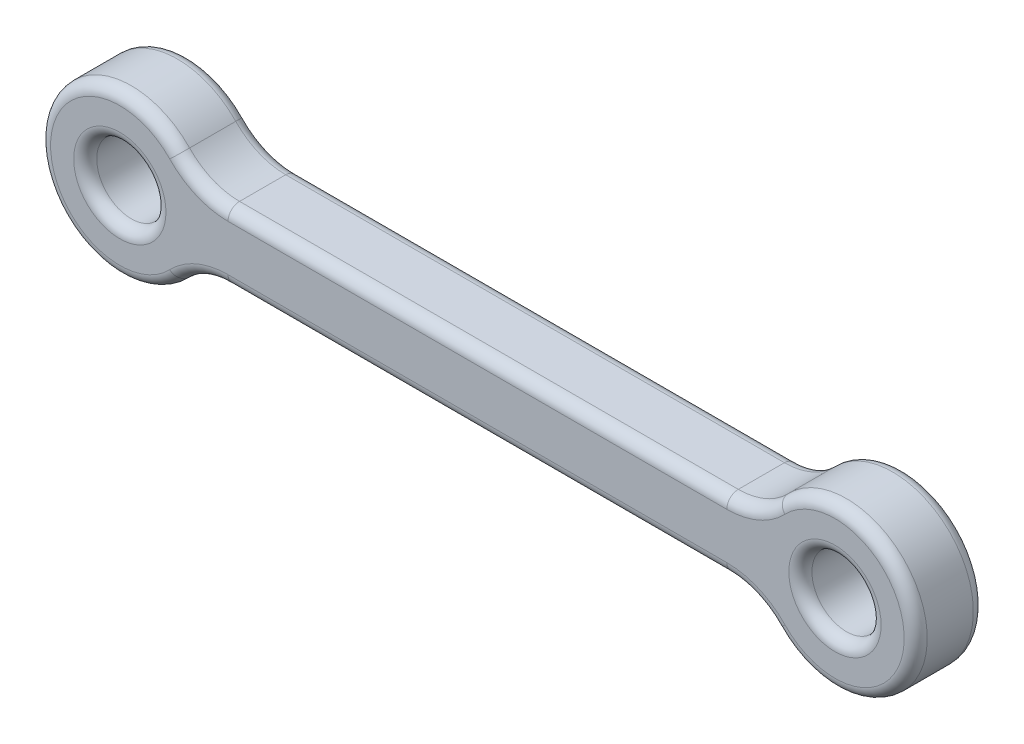
ISO-10303-21;
HEADER;
FILE_DESCRIPTION(('STEP AP214'),'2;1');
FILE_NAME('part.step','',(''),(''),'','','');
FILE_SCHEMA(('AUTOMOTIVE_DESIGN { 1 0 10303 214 1 1 1 1 }'));
ENDSEC;
DATA;
#1=APPLICATION_CONTEXT('core data for automotive mechanical design processes');
#2=APPLICATION_PROTOCOL_DEFINITION('international standard','automotive_design',2000,#1);
#3=PRODUCT_CONTEXT('',#1,'mechanical');
#4=PRODUCT('Part','Part','',(#3));
#5=PRODUCT_RELATED_PRODUCT_CATEGORY('part','',(#4));
#6=PRODUCT_DEFINITION_FORMATION('','',#4);
#7=PRODUCT_DEFINITION_CONTEXT('part definition',#1,'design');
#8=PRODUCT_DEFINITION('design','',#6,#7);
#9=PRODUCT_DEFINITION_SHAPE('','',#8);
#10=(LENGTH_UNIT() NAMED_UNIT(*) SI_UNIT(.MILLI.,.METRE.));
#11=(NAMED_UNIT(*) PLANE_ANGLE_UNIT() SI_UNIT($,.RADIAN.));
#12=(NAMED_UNIT(*) SI_UNIT($,.STERADIAN.) SOLID_ANGLE_UNIT());
#13=UNCERTAINTY_MEASURE_WITH_UNIT(LENGTH_MEASURE(1.E-05),#10,'distance_accuracy_value','');
#14=(GEOMETRIC_REPRESENTATION_CONTEXT(3) GLOBAL_UNCERTAINTY_ASSIGNED_CONTEXT((#13)) GLOBAL_UNIT_ASSIGNED_CONTEXT((#10,
#11,#12)) REPRESENTATION_CONTEXT('',''));
#15=CARTESIAN_POINT('',(0.,0.,0.));
#16=DIRECTION('',(0.,0.,1.));
#17=DIRECTION('',(1.,0.,0.));
#18=AXIS2_PLACEMENT_3D('',#15,#16,#17);
#19=CARTESIAN_POINT('',(36.0571966471025,8.55,-4.34829546427473));
#20=DIRECTION('',(0.,0.,1.));
#21=DIRECTION('',(1.,0.,0.));
#22=AXIS2_PLACEMENT_3D('',#19,#20,#21);
#23=CYLINDRICAL_SURFACE('',#22,5.7);
#24=DIRECTION('',(0.,0.,1.));
#25=VECTOR('',#24,1.);
#26=CARTESIAN_POINT('',(40.1703304672554,4.60384615384615,-4.34829546427473));
#27=LINE('',#26,#25);
#28=CARTESIAN_POINT('',(40.1703304672554,4.60384615384615,-3.39829546427473));
#29=VERTEX_POINT('',#28);
#30=CARTESIAN_POINT('',(40.1703304672554,4.60384615384615,0.401704535725267));
#31=VERTEX_POINT('',#30);
#32=EDGE_CURVE('E156',#29,#31,#27,.T.);
#33=ORIENTED_EDGE('',*,*,#32,.F.);
#34=CARTESIAN_POINT('',(36.0571966471025,8.55,-3.39829546427473));
#35=DIRECTION('',(0.,0.,1.));
#36=DIRECTION('',(1.,0.,0.));
#37=AXIS2_PLACEMENT_3D('',#34,#35,#36);
#38=CIRCLE('',#37,5.7);
#39=CARTESIAN_POINT('',(36.0571966471025,2.85,-3.39829546427473));
#40=VERTEX_POINT('',#39);
#41=EDGE_CURVE('E171',#29,#40,#38,.F.);
#42=ORIENTED_EDGE('',*,*,#41,.T.);
#43=DIRECTION('',(0.,0.,1.));
#44=VECTOR('',#43,1.);
#45=CARTESIAN_POINT('',(36.0571966471025,2.85,-4.34829546427473));
#46=LINE('',#45,#44);
#47=CARTESIAN_POINT('',(36.0571966471025,2.85,0.401704535725267));
#48=VERTEX_POINT('',#47);
#49=EDGE_CURVE('E334',#40,#48,#46,.T.);
#50=ORIENTED_EDGE('',*,*,#49,.T.);
#51=CARTESIAN_POINT('',(36.0571966471025,8.55,0.401704535725267));
#52=DIRECTION('',(0.,0.,1.));
#53=DIRECTION('',(1.,0.,0.));
#54=AXIS2_PLACEMENT_3D('',#51,#52,#53);
#55=CIRCLE('',#54,5.7);
#56=EDGE_CURVE('E174',#48,#31,#55,.T.);
#57=ORIENTED_EDGE('',*,*,#56,.T.);
#58=EDGE_LOOP('',(#33,#42,#50,#57));
#59=FACE_BOUND('',#58,.T.);
#60=ADVANCED_FACE('F38',(#59),#23,.F.);
#61=CARTESIAN_POINT('',(44.968986590767,0.,-4.34829546427473));
#62=DIRECTION('',(0.,0.,1.));
#63=DIRECTION('',(1.,0.,0.));
#64=AXIS2_PLACEMENT_3D('',#61,#62,#63);
#65=CYLINDRICAL_SURFACE('',#64,6.65);
#66=DIRECTION('',(0.,0.,1.));
#67=VECTOR('',#66,1.);
#68=CARTESIAN_POINT('',(40.1703304672554,-4.60384615384615,-4.34829546427473));
#69=LINE('',#68,#67);
#70=CARTESIAN_POINT('',(40.1703304672554,-4.60384615384615,-3.39829546427473));
#71=VERTEX_POINT('',#70);
#72=CARTESIAN_POINT('',(40.1703304672554,-4.60384615384615,0.401704535725267));
#73=VERTEX_POINT('',#72);
#74=EDGE_CURVE('E158',#71,#73,#69,.T.);
#75=ORIENTED_EDGE('',*,*,#74,.F.);
#76=CARTESIAN_POINT('',(44.968986590767,0.,-3.39829546427473));
#77=DIRECTION('',(0.,0.,1.));
#78=DIRECTION('',(1.,0.,0.));
#79=AXIS2_PLACEMENT_3D('',#76,#77,#78);
#80=CIRCLE('',#79,6.65);
#81=EDGE_CURVE('E153',#71,#29,#80,.T.);
#82=ORIENTED_EDGE('',*,*,#81,.T.);
#83=ORIENTED_EDGE('',*,*,#32,.T.);
#84=CARTESIAN_POINT('',(44.968986590767,0.,0.401704535725267));
#85=DIRECTION('',(0.,0.,1.));
#86=DIRECTION('',(1.,0.,0.));
#87=AXIS2_PLACEMENT_3D('',#84,#85,#86);
#88=CIRCLE('',#87,6.65);
#89=EDGE_CURVE('E164',#31,#73,#88,.F.);
#90=ORIENTED_EDGE('',*,*,#89,.T.);
#91=EDGE_LOOP('',(#75,#82,#83,#90));
#92=FACE_BOUND('',#91,.T.);
#93=ADVANCED_FACE('F155',(#92),#65,.T.);
#94=CARTESIAN_POINT('',(36.0571966471025,-8.55,-4.34829546427473));
#95=DIRECTION('',(0.,0.,1.));
#96=DIRECTION('',(1.,0.,0.));
#97=AXIS2_PLACEMENT_3D('',#94,#95,#96);
#98=CYLINDRICAL_SURFACE('',#97,5.7);
#99=DIRECTION('',(0.,0.,1.));
#100=VECTOR('',#99,1.);
#101=CARTESIAN_POINT('',(36.0571966471025,-2.85,-4.34829546427473));
#102=LINE('',#101,#100);
#103=CARTESIAN_POINT('',(36.0571966471025,-2.85,-3.39829546427473));
#104=VERTEX_POINT('',#103);
#105=CARTESIAN_POINT('',(36.0571966471025,-2.85,0.401704535725267));
#106=VERTEX_POINT('',#105);
#107=EDGE_CURVE('E327',#104,#106,#102,.T.);
#108=ORIENTED_EDGE('',*,*,#107,.F.);
#109=CARTESIAN_POINT('',(36.0571966471025,-8.55,-3.39829546427473));
#110=DIRECTION('',(0.,0.,1.));
#111=DIRECTION('',(1.,0.,0.));
#112=AXIS2_PLACEMENT_3D('',#109,#110,#111);
#113=CIRCLE('',#112,5.7);
#114=EDGE_CURVE('E213',#104,#71,#113,.F.);
#115=ORIENTED_EDGE('',*,*,#114,.T.);
#116=ORIENTED_EDGE('',*,*,#74,.T.);
#117=CARTESIAN_POINT('',(36.0571966471025,-8.55,0.401704535725267));
#118=DIRECTION('',(0.,0.,1.));
#119=DIRECTION('',(1.,0.,0.));
#120=AXIS2_PLACEMENT_3D('',#117,#118,#119);
#121=CIRCLE('',#120,5.7);
#122=EDGE_CURVE('E163',#73,#106,#121,.T.);
#123=ORIENTED_EDGE('',*,*,#122,.T.);
#124=EDGE_LOOP('',(#108,#115,#116,#123));
#125=FACE_BOUND('',#124,.T.);
#126=ADVANCED_FACE('F347',(#125),#98,.F.);
#127=CARTESIAN_POINT('',(-5.01922346556844,-2.85,-4.34829546427473));
#128=DIRECTION('',(0.,-1.,0.));
#129=DIRECTION('',(0.,0.,-1.));
#130=AXIS2_PLACEMENT_3D('',#127,#128,#129);
#131=PLANE('',#130);
#132=DIRECTION('',(0.,0.,1.));
#133=VECTOR('',#132,1.);
#134=CARTESIAN_POINT('',(-5.01922346556844,-2.85,-4.34829546427473));
#135=LINE('',#134,#133);
#136=CARTESIAN_POINT('',(-5.01922346556844,-2.85,-3.39829546427473));
#137=VERTEX_POINT('',#136);
#138=CARTESIAN_POINT('',(-5.01922346556844,-2.85,0.401704535725267));
#139=VERTEX_POINT('',#138);
#140=EDGE_CURVE('E319',#137,#139,#135,.T.);
#141=ORIENTED_EDGE('',*,*,#140,.F.);
#142=DIRECTION('',(1.,0.,0.));
#143=VECTOR('',#142,1.);
#144=CARTESIAN_POINT('',(36.0571966471025,-2.85,-3.39829546427473));
#145=LINE('',#144,#143);
#146=EDGE_CURVE('E217',#137,#104,#145,.T.);
#147=ORIENTED_EDGE('',*,*,#146,.T.);
#148=ORIENTED_EDGE('',*,*,#107,.T.);
#149=DIRECTION('',(1.,0.,0.));
#150=VECTOR('',#149,1.);
#151=CARTESIAN_POINT('',(-5.01922346556844,-2.85,0.401704535725267));
#152=LINE('',#151,#150);
#153=EDGE_CURVE('E215',#106,#139,#152,.F.);
#154=ORIENTED_EDGE('',*,*,#153,.T.);
#155=EDGE_LOOP('',(#141,#147,#148,#154));
#156=FACE_BOUND('',#155,.T.);
#157=ADVANCED_FACE('F343',(#156),#131,.T.);
#158=CARTESIAN_POINT('',(-5.01922346556844,-8.55,-4.34829546427473));
#159=DIRECTION('',(0.,0.,1.));
#160=DIRECTION('',(1.,0.,0.));
#161=AXIS2_PLACEMENT_3D('',#158,#159,#160);
#162=CYLINDRICAL_SURFACE('',#161,5.7);
#163=DIRECTION('',(0.,0.,1.));
#164=VECTOR('',#163,1.);
#165=CARTESIAN_POINT('',(-9.1323572857213,-4.60384615384616,-4.34829546427473));
#166=LINE('',#165,#164);
#167=CARTESIAN_POINT('',(-9.1323572857213,-4.60384615384616,-3.39829546427473));
#168=VERTEX_POINT('',#167);
#169=CARTESIAN_POINT('',(-9.1323572857213,-4.60384615384616,0.401704535725267));
#170=VERTEX_POINT('',#169);
#171=EDGE_CURVE('E316',#168,#170,#166,.T.);
#172=ORIENTED_EDGE('',*,*,#171,.F.);
#173=CARTESIAN_POINT('',(-5.01922346556844,-8.55,-3.39829546427473));
#174=DIRECTION('',(0.,0.,1.));
#175=DIRECTION('',(1.,0.,0.));
#176=AXIS2_PLACEMENT_3D('',#173,#174,#175);
#177=CIRCLE('',#176,5.7);
#178=EDGE_CURVE('E221',#168,#137,#177,.F.);
#179=ORIENTED_EDGE('',*,*,#178,.T.);
#180=ORIENTED_EDGE('',*,*,#140,.T.);
#181=CARTESIAN_POINT('',(-5.01922346556844,-8.55,0.401704535725267));
#182=DIRECTION('',(0.,0.,1.));
#183=DIRECTION('',(1.,0.,0.));
#184=AXIS2_PLACEMENT_3D('',#181,#182,#183);
#185=CIRCLE('',#184,5.7);
#186=EDGE_CURVE('E219',#139,#170,#185,.T.);
#187=ORIENTED_EDGE('',*,*,#186,.T.);
#188=EDGE_LOOP('',(#172,#179,#180,#187));
#189=FACE_BOUND('',#188,.T.);
#190=ADVANCED_FACE('F315',(#189),#162,.F.);
#191=CARTESIAN_POINT('',(-13.931013409233,0.,-4.34829546427473));
#192=DIRECTION('',(0.,0.,1.));
#193=DIRECTION('',(1.,0.,0.));
#194=AXIS2_PLACEMENT_3D('',#191,#192,#193);
#195=CYLINDRICAL_SURFACE('',#194,6.65);
#196=DIRECTION('',(0.,0.,1.));
#197=VECTOR('',#196,1.);
#198=CARTESIAN_POINT('',(-9.1323572857213,4.60384615384616,-4.34829546427473));
#199=LINE('',#198,#197);
#200=CARTESIAN_POINT('',(-9.1323572857213,4.60384615384616,-3.39829546427473));
#201=VERTEX_POINT('',#200);
#202=CARTESIAN_POINT('',(-9.1323572857213,4.60384615384616,0.401704535725267));
#203=VERTEX_POINT('',#202);
#204=EDGE_CURVE('E325',#201,#203,#199,.T.);
#205=ORIENTED_EDGE('',*,*,#204,.F.);
#206=CARTESIAN_POINT('',(-13.931013409233,0.,-3.39829546427473));
#207=DIRECTION('',(0.,0.,1.));
#208=DIRECTION('',(1.,0.,0.));
#209=AXIS2_PLACEMENT_3D('',#206,#207,#208);
#210=CIRCLE('',#209,6.65);
#211=EDGE_CURVE('E225',#201,#168,#210,.T.);
#212=ORIENTED_EDGE('',*,*,#211,.T.);
#213=ORIENTED_EDGE('',*,*,#171,.T.);
#214=CARTESIAN_POINT('',(-13.931013409233,0.,0.401704535725267));
#215=DIRECTION('',(0.,0.,1.));
#216=DIRECTION('',(1.,0.,0.));
#217=AXIS2_PLACEMENT_3D('',#214,#215,#216);
#218=CIRCLE('',#217,6.65);
#219=EDGE_CURVE('E223',#170,#203,#218,.F.);
#220=ORIENTED_EDGE('',*,*,#219,.T.);
#221=EDGE_LOOP('',(#205,#212,#213,#220));
#222=FACE_BOUND('',#221,.T.);
#223=ADVANCED_FACE('F322',(#222),#195,.T.);
#224=CARTESIAN_POINT('',(-5.01922346556844,8.55,-4.34829546427473));
#225=DIRECTION('',(0.,0.,1.));
#226=DIRECTION('',(1.,0.,0.));
#227=AXIS2_PLACEMENT_3D('',#224,#225,#226);
#228=CYLINDRICAL_SURFACE('',#227,5.7);
#229=DIRECTION('',(0.,0.,1.));
#230=VECTOR('',#229,1.);
#231=CARTESIAN_POINT('',(-5.01922346556844,2.85,-4.34829546427473));
#232=LINE('',#231,#230);
#233=CARTESIAN_POINT('',(-5.01922346556844,2.85,-3.39829546427473));
#234=VERTEX_POINT('',#233);
#235=CARTESIAN_POINT('',(-5.01922346556844,2.85,0.401704535725267));
#236=VERTEX_POINT('',#235);
#237=EDGE_CURVE('E329',#234,#236,#232,.T.);
#238=ORIENTED_EDGE('',*,*,#237,.F.);
#239=CARTESIAN_POINT('',(-5.01922346556844,8.55,-3.39829546427473));
#240=DIRECTION('',(0.,0.,1.));
#241=DIRECTION('',(1.,0.,0.));
#242=AXIS2_PLACEMENT_3D('',#239,#240,#241);
#243=CIRCLE('',#242,5.7);
#244=EDGE_CURVE('E229',#234,#201,#243,.F.);
#245=ORIENTED_EDGE('',*,*,#244,.T.);
#246=ORIENTED_EDGE('',*,*,#204,.T.);
#247=CARTESIAN_POINT('',(-5.01922346556844,8.55,0.401704535725267));
#248=DIRECTION('',(0.,0.,1.));
#249=DIRECTION('',(1.,0.,0.));
#250=AXIS2_PLACEMENT_3D('',#247,#248,#249);
#251=CIRCLE('',#250,5.7);
#252=EDGE_CURVE('E227',#203,#236,#251,.T.);
#253=ORIENTED_EDGE('',*,*,#252,.T.);
#254=EDGE_LOOP('',(#238,#245,#246,#253));
#255=FACE_BOUND('',#254,.T.);
#256=ADVANCED_FACE('F369',(#255),#228,.F.);
#257=CARTESIAN_POINT('',(-5.01922346556844,2.85,-4.34829546427473));
#258=DIRECTION('',(0.,1.,0.));
#259=DIRECTION('',(0.,0.,1.));
#260=AXIS2_PLACEMENT_3D('',#257,#258,#259);
#261=PLANE('',#260);
#262=ORIENTED_EDGE('',*,*,#49,.F.);
#263=DIRECTION('',(-1.,0.,0.));
#264=VECTOR('',#263,1.);
#265=CARTESIAN_POINT('',(-5.01922346556844,2.85,-3.39829546427473));
#266=LINE('',#265,#264);
#267=EDGE_CURVE('E11',#40,#234,#266,.T.);
#268=ORIENTED_EDGE('',*,*,#267,.T.);
#269=ORIENTED_EDGE('',*,*,#237,.T.);
#270=DIRECTION('',(-1.,0.,0.));
#271=VECTOR('',#270,1.);
#272=CARTESIAN_POINT('',(-5.01922346556844,2.85,0.401704535725267));
#273=LINE('',#272,#271);
#274=EDGE_CURVE('E47',#236,#48,#273,.F.);
#275=ORIENTED_EDGE('',*,*,#274,.T.);
#276=EDGE_LOOP('',(#262,#268,#269,#275));
#277=FACE_BOUND('',#276,.T.);
#278=ADVANCED_FACE('F365',(#277),#261,.T.);
#279=CARTESIAN_POINT('',(36.0571966471025,8.55,-4.34829546427473));
#280=DIRECTION('',(0.,0.,1.));
#281=DIRECTION('',(1.,0.,0.));
#282=AXIS2_PLACEMENT_3D('',#279,#280,#281);
#283=PLANE('',#282);
#284=CARTESIAN_POINT('',(44.968986590767,0.,-4.34829546427473));
#285=DIRECTION('',(0.,0.,1.));
#286=DIRECTION('',(1.,0.,0.));
#287=AXIS2_PLACEMENT_3D('',#284,#285,#286);
#288=CIRCLE('',#287,3.80000000000001);
#289=CARTESIAN_POINT('',(48.768986590767,0.,-4.34829546427473));
#290=VERTEX_POINT('',#289);
#291=EDGE_CURVE('E208',#290,#290,#288,.T.);
#292=ORIENTED_EDGE('',*,*,#291,.T.);
#293=EDGE_LOOP('',(#292));
#294=FACE_BOUND('',#293,.T.);
#295=DIRECTION('',(-1.,0.,0.));
#296=VECTOR('',#295,1.);
#297=CARTESIAN_POINT('',(36.0571966471025,1.9,-4.34829546427473));
#298=LINE('',#297,#296);
#299=CARTESIAN_POINT('',(-5.01922346556844,1.9,-4.34829546427473));
#300=VERTEX_POINT('',#299);
#301=CARTESIAN_POINT('',(36.0571966471025,1.9,-4.34829546427473));
#302=VERTEX_POINT('',#301);
#303=EDGE_CURVE('E189',#300,#302,#298,.F.);
#304=ORIENTED_EDGE('',*,*,#303,.T.);
#305=CARTESIAN_POINT('',(36.0571966471025,8.55,-4.34829546427473));
#306=DIRECTION('',(0.,0.,1.));
#307=DIRECTION('',(1.,0.,0.));
#308=AXIS2_PLACEMENT_3D('',#305,#306,#307);
#309=CIRCLE('',#308,6.65);
#310=CARTESIAN_POINT('',(40.8558527706142,3.94615384615384,-4.34829546427473));
#311=VERTEX_POINT('',#310);
#312=EDGE_CURVE('E206',#302,#311,#309,.T.);
#313=ORIENTED_EDGE('',*,*,#312,.T.);
#314=CARTESIAN_POINT('',(44.968986590767,0.,-4.34829546427473));
#315=DIRECTION('',(0.,0.,1.));
#316=DIRECTION('',(1.,0.,0.));
#317=AXIS2_PLACEMENT_3D('',#314,#315,#316);
#318=CIRCLE('',#317,5.7);
#319=CARTESIAN_POINT('',(40.8558527706142,-3.94615384615385,-4.34829546427473));
#320=VERTEX_POINT('',#319);
#321=EDGE_CURVE('E179',#311,#320,#318,.F.);
#322=ORIENTED_EDGE('',*,*,#321,.T.);
#323=CARTESIAN_POINT('',(36.0571966471025,-8.55,-4.34829546427473));
#324=DIRECTION('',(0.,0.,1.));
#325=DIRECTION('',(1.,0.,0.));
#326=AXIS2_PLACEMENT_3D('',#323,#324,#325);
#327=CIRCLE('',#326,6.65);
#328=CARTESIAN_POINT('',(36.0571966471025,-1.9,-4.34829546427473));
#329=VERTEX_POINT('',#328);
#330=EDGE_CURVE('E203',#320,#329,#327,.T.);
#331=ORIENTED_EDGE('',*,*,#330,.T.);
#332=DIRECTION('',(1.,0.,0.));
#333=VECTOR('',#332,1.);
#334=CARTESIAN_POINT('',(-5.01922346556844,-1.9,-4.34829546427473));
#335=LINE('',#334,#333);
#336=CARTESIAN_POINT('',(-5.01922346556844,-1.9,-4.34829546427473));
#337=VERTEX_POINT('',#336);
#338=EDGE_CURVE('E201',#329,#337,#335,.F.);
#339=ORIENTED_EDGE('',*,*,#338,.T.);
#340=CARTESIAN_POINT('',(-5.01922346556844,-8.55,-4.34829546427473));
#341=DIRECTION('',(0.,0.,1.));
#342=DIRECTION('',(1.,0.,0.));
#343=AXIS2_PLACEMENT_3D('',#340,#341,#342);
#344=CIRCLE('',#343,6.65);
#345=CARTESIAN_POINT('',(-9.81787958908011,-3.94615384615385,-4.34829546427473));
#346=VERTEX_POINT('',#345);
#347=EDGE_CURVE('E199',#337,#346,#344,.T.);
#348=ORIENTED_EDGE('',*,*,#347,.T.);
#349=CARTESIAN_POINT('',(-13.931013409233,0.,-4.34829546427473));
#350=DIRECTION('',(0.,0.,1.));
#351=DIRECTION('',(1.,0.,0.));
#352=AXIS2_PLACEMENT_3D('',#349,#350,#351);
#353=CIRCLE('',#352,5.7);
#354=CARTESIAN_POINT('',(-9.81787958908011,3.94615384615385,-4.34829546427473));
#355=VERTEX_POINT('',#354);
#356=EDGE_CURVE('E197',#346,#355,#353,.F.);
#357=ORIENTED_EDGE('',*,*,#356,.T.);
#358=CARTESIAN_POINT('',(-5.01922346556844,8.55,-4.34829546427473));
#359=DIRECTION('',(0.,0.,1.));
#360=DIRECTION('',(1.,0.,0.));
#361=AXIS2_PLACEMENT_3D('',#358,#359,#360);
#362=CIRCLE('',#361,6.65);
#363=EDGE_CURVE('E191',#355,#300,#362,.T.);
#364=ORIENTED_EDGE('',*,*,#363,.T.);
#365=EDGE_LOOP('',(#304,#313,#322,#331,#339,#348,#357,#364));
#366=FACE_BOUND('',#365,.T.);
#367=CARTESIAN_POINT('',(-13.931013409233,0.,-4.34829546427473));
#368=DIRECTION('',(0.,0.,1.));
#369=DIRECTION('',(1.,0.,0.));
#370=AXIS2_PLACEMENT_3D('',#367,#368,#369);
#371=CIRCLE('',#370,2.85);
#372=CARTESIAN_POINT('',(-11.081013409233,0.,-4.34829546427473));
#373=VERTEX_POINT('',#372);
#374=EDGE_CURVE('E278',#373,#373,#371,.T.);
#375=ORIENTED_EDGE('',*,*,#374,.T.);
#376=EDGE_LOOP('',(#375));
#377=FACE_BOUND('',#376,.T.);
#378=ADVANCED_FACE('F357',(#294,#366,#377),#283,.F.);
#379=CARTESIAN_POINT('',(36.0571966471025,8.55,1.35170453572527));
#380=DIRECTION('',(0.,0.,1.));
#381=DIRECTION('',(1.,0.,0.));
#382=AXIS2_PLACEMENT_3D('',#379,#380,#381);
#383=PLANE('',#382);
#384=CARTESIAN_POINT('',(-13.931013409233,0.,1.35170453572527));
#385=DIRECTION('',(0.,0.,1.));
#386=DIRECTION('',(1.,0.,0.));
#387=AXIS2_PLACEMENT_3D('',#384,#385,#386);
#388=CIRCLE('',#387,3.8);
#389=CARTESIAN_POINT('',(-10.131013409233,0.,1.35170453572527));
#390=VERTEX_POINT('',#389);
#391=EDGE_CURVE('E248',#390,#390,#388,.F.);
#392=ORIENTED_EDGE('',*,*,#391,.T.);
#393=EDGE_LOOP('',(#392));
#394=FACE_BOUND('',#393,.T.);
#395=CARTESIAN_POINT('',(44.968986590767,0.,1.35170453572527));
#396=DIRECTION('',(0.,0.,1.));
#397=DIRECTION('',(1.,0.,0.));
#398=AXIS2_PLACEMENT_3D('',#395,#396,#397);
#399=CIRCLE('',#398,3.80000000000001);
#400=CARTESIAN_POINT('',(48.768986590767,0.,1.35170453572527));
#401=VERTEX_POINT('',#400);
#402=EDGE_CURVE('E245',#401,#401,#399,.F.);
#403=ORIENTED_EDGE('',*,*,#402,.T.);
#404=EDGE_LOOP('',(#403));
#405=FACE_BOUND('',#404,.T.);
#406=CARTESIAN_POINT('',(44.968986590767,0.,1.35170453572527));
#407=DIRECTION('',(0.,0.,1.));
#408=DIRECTION('',(1.,0.,0.));
#409=AXIS2_PLACEMENT_3D('',#406,#407,#408);
#410=CIRCLE('',#409,5.7);
#411=CARTESIAN_POINT('',(40.8558527706142,-3.94615384615385,1.35170453572527));
#412=VERTEX_POINT('',#411);
#413=CARTESIAN_POINT('',(40.8558527706142,3.94615384615384,1.35170453572527));
#414=VERTEX_POINT('',#413);
#415=EDGE_CURVE('E55',#412,#414,#410,.T.);
#416=ORIENTED_EDGE('',*,*,#415,.T.);
#417=CARTESIAN_POINT('',(36.0571966471025,8.55,1.35170453572527));
#418=DIRECTION('',(0.,0.,1.));
#419=DIRECTION('',(1.,0.,0.));
#420=AXIS2_PLACEMENT_3D('',#417,#418,#419);
#421=CIRCLE('',#420,6.65);
#422=CARTESIAN_POINT('',(36.0571966471025,1.9,1.35170453572527));
#423=VERTEX_POINT('',#422);
#424=EDGE_CURVE('E243',#414,#423,#421,.F.);
#425=ORIENTED_EDGE('',*,*,#424,.T.);
#426=DIRECTION('',(-1.,0.,0.));
#427=VECTOR('',#426,1.);
#428=CARTESIAN_POINT('',(36.0571966471025,1.9,1.35170453572527));
#429=LINE('',#428,#427);
#430=CARTESIAN_POINT('',(-5.01922346556844,1.9,1.35170453572527));
#431=VERTEX_POINT('',#430);
#432=EDGE_CURVE('E231',#423,#431,#429,.T.);
#433=ORIENTED_EDGE('',*,*,#432,.T.);
#434=CARTESIAN_POINT('',(-5.01922346556844,8.55,1.35170453572527));
#435=DIRECTION('',(0.,0.,1.));
#436=DIRECTION('',(1.,0.,0.));
#437=AXIS2_PLACEMENT_3D('',#434,#435,#436);
#438=CIRCLE('',#437,6.65);
#439=CARTESIAN_POINT('',(-9.81787958908011,3.94615384615385,1.35170453572527));
#440=VERTEX_POINT('',#439);
#441=EDGE_CURVE('E233',#431,#440,#438,.F.);
#442=ORIENTED_EDGE('',*,*,#441,.T.);
#443=CARTESIAN_POINT('',(-13.931013409233,0.,1.35170453572527));
#444=DIRECTION('',(0.,0.,1.));
#445=DIRECTION('',(1.,0.,0.));
#446=AXIS2_PLACEMENT_3D('',#443,#444,#445);
#447=CIRCLE('',#446,5.7);
#448=CARTESIAN_POINT('',(-9.81787958908011,-3.94615384615385,1.35170453572527));
#449=VERTEX_POINT('',#448);
#450=EDGE_CURVE('E235',#440,#449,#447,.T.);
#451=ORIENTED_EDGE('',*,*,#450,.T.);
#452=CARTESIAN_POINT('',(-5.01922346556844,-8.55,1.35170453572527));
#453=DIRECTION('',(0.,0.,1.));
#454=DIRECTION('',(1.,0.,0.));
#455=AXIS2_PLACEMENT_3D('',#452,#453,#454);
#456=CIRCLE('',#455,6.65);
#457=CARTESIAN_POINT('',(-5.01922346556844,-1.9,1.35170453572527));
#458=VERTEX_POINT('',#457);
#459=EDGE_CURVE('E237',#449,#458,#456,.F.);
#460=ORIENTED_EDGE('',*,*,#459,.T.);
#461=DIRECTION('',(1.,0.,0.));
#462=VECTOR('',#461,1.);
#463=CARTESIAN_POINT('',(36.0571966471025,-1.9,1.35170453572527));
#464=LINE('',#463,#462);
#465=CARTESIAN_POINT('',(36.0571966471025,-1.9,1.35170453572527));
#466=VERTEX_POINT('',#465);
#467=EDGE_CURVE('E239',#458,#466,#464,.T.);
#468=ORIENTED_EDGE('',*,*,#467,.T.);
#469=CARTESIAN_POINT('',(36.0571966471025,-8.55,1.35170453572527));
#470=DIRECTION('',(0.,0.,1.));
#471=DIRECTION('',(1.,0.,0.));
#472=AXIS2_PLACEMENT_3D('',#469,#470,#471);
#473=CIRCLE('',#472,6.65);
#474=EDGE_CURVE('E60',#466,#412,#473,.F.);
#475=ORIENTED_EDGE('',*,*,#474,.T.);
#476=EDGE_LOOP('',(#416,#425,#433,#442,#451,#460,#468,#475));
#477=FACE_BOUND('',#476,.T.);
#478=ADVANCED_FACE('F572',(#394,#405,#477),#383,.T.);
#479=CARTESIAN_POINT('',(-13.931013409233,0.,-4.34829546427473));
#480=DIRECTION('',(0.,0.,1.));
#481=DIRECTION('',(1.,0.,0.));
#482=AXIS2_PLACEMENT_3D('',#479,#480,#481);
#483=CYLINDRICAL_SURFACE('',#482,2.85);
#484=CARTESIAN_POINT('',(-13.931013409233,0.,0.401704535725267));
#485=DIRECTION('',(0.,0.,1.));
#486=DIRECTION('',(1.,0.,0.));
#487=AXIS2_PLACEMENT_3D('',#484,#485,#486);
#488=CIRCLE('',#487,2.85);
#489=CARTESIAN_POINT('',(-11.081013409233,0.,0.401704535725267));
#490=VERTEX_POINT('',#489);
#491=EDGE_CURVE('E251',#490,#490,#488,.T.);
#492=ORIENTED_EDGE('',*,*,#491,.T.);
#493=EDGE_LOOP('',(#492));
#494=FACE_BOUND('',#493,.T.);
#495=ORIENTED_EDGE('',*,*,#374,.F.);
#496=EDGE_LOOP('',(#495));
#497=FACE_BOUND('',#496,.T.);
#498=ADVANCED_FACE('F390',(#494,#497),#483,.F.);
#499=CARTESIAN_POINT('',(44.968986590767,0.,-4.34829546427473));
#500=DIRECTION('',(0.,0.,1.));
#501=DIRECTION('',(1.,0.,0.));
#502=AXIS2_PLACEMENT_3D('',#499,#500,#501);
#503=CYLINDRICAL_SURFACE('',#502,2.85000000000001);
#504=CARTESIAN_POINT('',(44.968986590767,0.,-3.39829546427473));
#505=DIRECTION('',(0.,0.,1.));
#506=DIRECTION('',(1.,0.,0.));
#507=AXIS2_PLACEMENT_3D('',#504,#505,#506);
#508=CIRCLE('',#507,2.85000000000001);
#509=CARTESIAN_POINT('',(47.818986590767,0.,-3.39829546427473));
#510=VERTEX_POINT('',#509);
#511=EDGE_CURVE('E257',#510,#510,#508,.F.);
#512=ORIENTED_EDGE('',*,*,#511,.T.);
#513=EDGE_LOOP('',(#512));
#514=FACE_BOUND('',#513,.T.);
#515=CARTESIAN_POINT('',(44.968986590767,0.,0.401704535725267));
#516=DIRECTION('',(0.,0.,1.));
#517=DIRECTION('',(1.,0.,0.));
#518=AXIS2_PLACEMENT_3D('',#515,#516,#517);
#519=CIRCLE('',#518,2.85000000000001);
#520=CARTESIAN_POINT('',(47.818986590767,0.,0.401704535725267));
#521=VERTEX_POINT('',#520);
#522=EDGE_CURVE('E254',#521,#521,#519,.T.);
#523=ORIENTED_EDGE('',*,*,#522,.T.);
#524=EDGE_LOOP('',(#523));
#525=FACE_BOUND('',#524,.T.);
#526=ADVANCED_FACE('F383',(#514,#525),#503,.F.);
#527=CARTESIAN_POINT('',(-5.01922346556844,-8.55,-3.39829546427473));
#528=DIRECTION('',(0.,0.,1.));
#529=DIRECTION('',(1.,0.,0.));
#530=AXIS2_PLACEMENT_3D('',#527,#528,#529);
#531=TOROIDAL_SURFACE('',#530,6.65,0.95);
#532=CARTESIAN_POINT('',(-9.81787958908011,-3.94615384615385,-3.39829546427473));
#533=DIRECTION('',(-0.692307692307692,-0.72160242458822,0.));
#534=DIRECTION('',(0.72160242458822,-0.692307692307692,0.));
#535=AXIS2_PLACEMENT_3D('',#532,#533,#534);
#536=CIRCLE('',#535,0.95);
#537=EDGE_CURVE('E272',#346,#168,#536,.T.);
#538=ORIENTED_EDGE('',*,*,#537,.F.);
#539=ORIENTED_EDGE('',*,*,#347,.F.);
#540=CARTESIAN_POINT('',(-5.01922346556844,-1.9,-3.39829546427473));
#541=DIRECTION('',(1.,0.,0.));
#542=DIRECTION('',(0.,0.,-1.));
#543=AXIS2_PLACEMENT_3D('',#540,#541,#542);
#544=CIRCLE('',#543,0.95);
#545=EDGE_CURVE('E275',#137,#337,#544,.T.);
#546=ORIENTED_EDGE('',*,*,#545,.F.);
#547=ORIENTED_EDGE('',*,*,#178,.F.);
#548=EDGE_LOOP('',(#538,#539,#546,#547));
#549=FACE_BOUND('',#548,.T.);
#550=ADVANCED_FACE('F380',(#549),#531,.T.);
#551=CARTESIAN_POINT('',(-5.01922346556844,-1.9,-3.39829546427473));
#552=DIRECTION('',(-1.,0.,0.));
#553=DIRECTION('',(0.,0.,1.));
#554=AXIS2_PLACEMENT_3D('',#551,#552,#553);
#555=CYLINDRICAL_SURFACE('',#554,0.95);
#556=ORIENTED_EDGE('',*,*,#545,.T.);
#557=ORIENTED_EDGE('',*,*,#338,.F.);
#558=CARTESIAN_POINT('',(36.0571966471025,-1.9,-3.39829546427473));
#559=DIRECTION('',(1.,0.,0.));
#560=DIRECTION('',(0.,0.,-1.));
#561=AXIS2_PLACEMENT_3D('',#558,#559,#560);
#562=CIRCLE('',#561,0.95);
#563=EDGE_CURVE('E269',#104,#329,#562,.T.);
#564=ORIENTED_EDGE('',*,*,#563,.F.);
#565=ORIENTED_EDGE('',*,*,#146,.F.);
#566=EDGE_LOOP('',(#556,#557,#564,#565));
#567=FACE_BOUND('',#566,.T.);
#568=ADVANCED_FACE('F352',(#567),#555,.T.);
#569=CARTESIAN_POINT('',(-13.931013409233,0.,-3.39829546427473));
#570=DIRECTION('',(0.,0.,1.));
#571=DIRECTION('',(1.,0.,0.));
#572=AXIS2_PLACEMENT_3D('',#569,#570,#571);
#573=TOROIDAL_SURFACE('',#572,5.7,0.95);
#574=ORIENTED_EDGE('',*,*,#537,.T.);
#575=ORIENTED_EDGE('',*,*,#211,.F.);
#576=CARTESIAN_POINT('',(-9.81787958908011,3.94615384615385,-3.39829546427473));
#577=DIRECTION('',(0.692307692307693,-0.72160242458822,0.));
#578=DIRECTION('',(0.72160242458822,0.692307692307693,0.));
#579=AXIS2_PLACEMENT_3D('',#576,#577,#578);
#580=CIRCLE('',#579,0.95);
#581=EDGE_CURVE('E266',#355,#201,#580,.T.);
#582=ORIENTED_EDGE('',*,*,#581,.F.);
#583=ORIENTED_EDGE('',*,*,#356,.F.);
#584=EDGE_LOOP('',(#574,#575,#582,#583));
#585=FACE_BOUND('',#584,.T.);
#586=ADVANCED_FACE('F377',(#585),#573,.T.);
#587=CARTESIAN_POINT('',(36.0571966471025,-8.55,-3.39829546427473));
#588=DIRECTION('',(0.,0.,1.));
#589=DIRECTION('',(1.,0.,0.));
#590=AXIS2_PLACEMENT_3D('',#587,#588,#589);
#591=TOROIDAL_SURFACE('',#590,6.65,0.95);
#592=ORIENTED_EDGE('',*,*,#563,.T.);
#593=ORIENTED_EDGE('',*,*,#330,.F.);
#594=CARTESIAN_POINT('',(40.8558527706142,-3.94615384615384,-3.39829546427473));
#595=DIRECTION('',(0.692307692307692,-0.72160242458822,0.));
#596=DIRECTION('',(0.72160242458822,0.692307692307692,0.));
#597=AXIS2_PLACEMENT_3D('',#594,#595,#596);
#598=CIRCLE('',#597,0.95);
#599=EDGE_CURVE('E264',#71,#320,#598,.T.);
#600=ORIENTED_EDGE('',*,*,#599,.F.);
#601=ORIENTED_EDGE('',*,*,#114,.F.);
#602=EDGE_LOOP('',(#592,#593,#600,#601));
#603=FACE_BOUND('',#602,.T.);
#604=ADVANCED_FACE('F355',(#603),#591,.T.);
#605=CARTESIAN_POINT('',(-5.01922346556844,8.55,-3.39829546427473));
#606=DIRECTION('',(0.,0.,1.));
#607=DIRECTION('',(1.,0.,0.));
#608=AXIS2_PLACEMENT_3D('',#605,#606,#607);
#609=TOROIDAL_SURFACE('',#608,6.65,0.95);
#610=ORIENTED_EDGE('',*,*,#581,.T.);
#611=ORIENTED_EDGE('',*,*,#244,.F.);
#612=CARTESIAN_POINT('',(-5.01922346556844,1.9,-3.39829546427473));
#613=DIRECTION('',(1.,0.,0.));
#614=DIRECTION('',(0.,0.,-1.));
#615=AXIS2_PLACEMENT_3D('',#612,#613,#614);
#616=CIRCLE('',#615,0.95);
#617=EDGE_CURVE('E183',#300,#234,#616,.T.);
#618=ORIENTED_EDGE('',*,*,#617,.F.);
#619=ORIENTED_EDGE('',*,*,#363,.F.);
#620=EDGE_LOOP('',(#610,#611,#618,#619));
#621=FACE_BOUND('',#620,.T.);
#622=ADVANCED_FACE('F372',(#621),#609,.T.);
#623=CARTESIAN_POINT('',(44.968986590767,0.,-3.39829546427473));
#624=DIRECTION('',(0.,0.,1.));
#625=DIRECTION('',(1.,0.,0.));
#626=AXIS2_PLACEMENT_3D('',#623,#624,#625);
#627=TOROIDAL_SURFACE('',#626,5.7,0.95);
#628=ORIENTED_EDGE('',*,*,#599,.T.);
#629=ORIENTED_EDGE('',*,*,#321,.F.);
#630=CARTESIAN_POINT('',(40.8558527706142,3.94615384615385,-3.39829546427473));
#631=DIRECTION('',(-0.692307692307692,-0.72160242458822,0.));
#632=DIRECTION('',(0.72160242458822,-0.692307692307692,0.));
#633=AXIS2_PLACEMENT_3D('',#630,#631,#632);
#634=CIRCLE('',#633,0.95);
#635=EDGE_CURVE('E177',#29,#311,#634,.T.);
#636=ORIENTED_EDGE('',*,*,#635,.F.);
#637=ORIENTED_EDGE('',*,*,#81,.F.);
#638=EDGE_LOOP('',(#628,#629,#636,#637));
#639=FACE_BOUND('',#638,.T.);
#640=ADVANCED_FACE('F178',(#639),#627,.T.);
#641=CARTESIAN_POINT('',(-5.01922346556844,1.9,-3.39829546427473));
#642=DIRECTION('',(1.,0.,0.));
#643=DIRECTION('',(0.,0.,-1.));
#644=AXIS2_PLACEMENT_3D('',#641,#642,#643);
#645=CYLINDRICAL_SURFACE('',#644,0.95);
#646=ORIENTED_EDGE('',*,*,#617,.T.);
#647=ORIENTED_EDGE('',*,*,#267,.F.);
#648=CARTESIAN_POINT('',(36.0571966471025,1.9,-3.39829546427473));
#649=DIRECTION('',(1.,0.,0.));
#650=DIRECTION('',(0.,0.,-1.));
#651=AXIS2_PLACEMENT_3D('',#648,#649,#650);
#652=CIRCLE('',#651,0.95);
#653=EDGE_CURVE('E184',#302,#40,#652,.T.);
#654=ORIENTED_EDGE('',*,*,#653,.F.);
#655=ORIENTED_EDGE('',*,*,#303,.F.);
#656=EDGE_LOOP('',(#646,#647,#654,#655));
#657=FACE_BOUND('',#656,.T.);
#658=ADVANCED_FACE('F361',(#657),#645,.T.);
#659=CARTESIAN_POINT('',(36.0571966471025,8.55,-3.39829546427473));
#660=DIRECTION('',(0.,0.,1.));
#661=DIRECTION('',(1.,0.,0.));
#662=AXIS2_PLACEMENT_3D('',#659,#660,#661);
#663=TOROIDAL_SURFACE('',#662,6.65,0.95);
#664=ORIENTED_EDGE('',*,*,#635,.T.);
#665=ORIENTED_EDGE('',*,*,#312,.F.);
#666=ORIENTED_EDGE('',*,*,#653,.T.);
#667=ORIENTED_EDGE('',*,*,#41,.F.);
#668=EDGE_LOOP('',(#664,#665,#666,#667));
#669=FACE_BOUND('',#668,.T.);
#670=ADVANCED_FACE('F186',(#669),#663,.T.);
#671=CARTESIAN_POINT('',(-5.01922346556844,-8.55,0.401704535725267));
#672=DIRECTION('',(0.,0.,1.));
#673=DIRECTION('',(1.,0.,0.));
#674=AXIS2_PLACEMENT_3D('',#671,#672,#673);
#675=TOROIDAL_SURFACE('',#674,6.65,0.95);
#676=CARTESIAN_POINT('',(-9.81787958908011,-3.94615384615385,0.401704535725267));
#677=DIRECTION('',(-0.692307692307692,-0.72160242458822,0.));
#678=DIRECTION('',(0.72160242458822,-0.692307692307692,0.));
#679=AXIS2_PLACEMENT_3D('',#676,#677,#678);
#680=CIRCLE('',#679,0.95);
#681=EDGE_CURVE('E294',#170,#449,#680,.T.);
#682=ORIENTED_EDGE('',*,*,#681,.F.);
#683=ORIENTED_EDGE('',*,*,#186,.F.);
#684=CARTESIAN_POINT('',(-5.01922346556844,-1.9,0.401704535725267));
#685=DIRECTION('',(1.,0.,0.));
#686=DIRECTION('',(0.,0.,-1.));
#687=AXIS2_PLACEMENT_3D('',#684,#685,#686);
#688=CIRCLE('',#687,0.95);
#689=EDGE_CURVE('E42',#458,#139,#688,.T.);
#690=ORIENTED_EDGE('',*,*,#689,.F.);
#691=ORIENTED_EDGE('',*,*,#459,.F.);
#692=EDGE_LOOP('',(#682,#683,#690,#691));
#693=FACE_BOUND('',#692,.T.);
#694=ADVANCED_FACE('F310',(#693),#675,.T.);
#695=CARTESIAN_POINT('',(36.0571966471025,-1.9,0.401704535725267));
#696=DIRECTION('',(1.,0.,0.));
#697=DIRECTION('',(0.,0.,-1.));
#698=AXIS2_PLACEMENT_3D('',#695,#696,#697);
#699=CYLINDRICAL_SURFACE('',#698,0.95);
#700=ORIENTED_EDGE('',*,*,#689,.T.);
#701=ORIENTED_EDGE('',*,*,#153,.F.);
#702=CARTESIAN_POINT('',(36.0571966471025,-1.9,0.401704535725267));
#703=DIRECTION('',(1.,0.,0.));
#704=DIRECTION('',(0.,0.,-1.));
#705=AXIS2_PLACEMENT_3D('',#702,#703,#704);
#706=CIRCLE('',#705,0.95);
#707=EDGE_CURVE('E292',#466,#106,#706,.T.);
#708=ORIENTED_EDGE('',*,*,#707,.F.);
#709=ORIENTED_EDGE('',*,*,#467,.F.);
#710=EDGE_LOOP('',(#700,#701,#708,#709));
#711=FACE_BOUND('',#710,.T.);
#712=ADVANCED_FACE('F305',(#711),#699,.T.);
#713=CARTESIAN_POINT('',(-13.931013409233,0.,0.401704535725267));
#714=DIRECTION('',(0.,0.,1.));
#715=DIRECTION('',(1.,0.,0.));
#716=AXIS2_PLACEMENT_3D('',#713,#714,#715);
#717=TOROIDAL_SURFACE('',#716,5.7,0.95);
#718=ORIENTED_EDGE('',*,*,#681,.T.);
#719=ORIENTED_EDGE('',*,*,#450,.F.);
#720=CARTESIAN_POINT('',(-9.81787958908011,3.94615384615385,0.401704535725267));
#721=DIRECTION('',(0.692307692307693,-0.72160242458822,0.));
#722=DIRECTION('',(0.72160242458822,0.692307692307693,0.));
#723=AXIS2_PLACEMENT_3D('',#720,#721,#722);
#724=CIRCLE('',#723,0.95);
#725=EDGE_CURVE('E289',#203,#440,#724,.T.);
#726=ORIENTED_EDGE('',*,*,#725,.F.);
#727=ORIENTED_EDGE('',*,*,#219,.F.);
#728=EDGE_LOOP('',(#718,#719,#726,#727));
#729=FACE_BOUND('',#728,.T.);
#730=ADVANCED_FACE('F450',(#729),#717,.T.);
#731=CARTESIAN_POINT('',(36.0571966471025,-8.55,0.401704535725267));
#732=DIRECTION('',(0.,0.,1.));
#733=DIRECTION('',(1.,0.,0.));
#734=AXIS2_PLACEMENT_3D('',#731,#732,#733);
#735=TOROIDAL_SURFACE('',#734,6.65,0.95);
#736=ORIENTED_EDGE('',*,*,#707,.T.);
#737=ORIENTED_EDGE('',*,*,#122,.F.);
#738=CARTESIAN_POINT('',(40.8558527706142,-3.94615384615385,0.401704535725267));
#739=DIRECTION('',(0.692307692307691,-0.721602424588221,0.));
#740=DIRECTION('',(0.721602424588221,0.692307692307691,0.));
#741=AXIS2_PLACEMENT_3D('',#738,#739,#740);
#742=CIRCLE('',#741,0.95);
#743=EDGE_CURVE('E286',#412,#73,#742,.T.);
#744=ORIENTED_EDGE('',*,*,#743,.F.);
#745=ORIENTED_EDGE('',*,*,#474,.F.);
#746=EDGE_LOOP('',(#736,#737,#744,#745));
#747=FACE_BOUND('',#746,.T.);
#748=ADVANCED_FACE('F457',(#747),#735,.T.);
#749=CARTESIAN_POINT('',(-5.01922346556844,8.55,0.401704535725267));
#750=DIRECTION('',(0.,0.,1.));
#751=DIRECTION('',(1.,0.,0.));
#752=AXIS2_PLACEMENT_3D('',#749,#750,#751);
#753=TOROIDAL_SURFACE('',#752,6.65,0.95);
#754=ORIENTED_EDGE('',*,*,#725,.T.);
#755=ORIENTED_EDGE('',*,*,#441,.F.);
#756=CARTESIAN_POINT('',(-5.01922346556844,1.9,0.401704535725267));
#757=DIRECTION('',(1.,0.,0.));
#758=DIRECTION('',(0.,0.,-1.));
#759=AXIS2_PLACEMENT_3D('',#756,#757,#758);
#760=CIRCLE('',#759,0.95);
#761=EDGE_CURVE('E283',#236,#431,#760,.T.);
#762=ORIENTED_EDGE('',*,*,#761,.F.);
#763=ORIENTED_EDGE('',*,*,#252,.F.);
#764=EDGE_LOOP('',(#754,#755,#762,#763));
#765=FACE_BOUND('',#764,.T.);
#766=ADVANCED_FACE('F464',(#765),#753,.T.);
#767=CARTESIAN_POINT('',(44.968986590767,0.,0.401704535725267));
#768=DIRECTION('',(0.,0.,1.));
#769=DIRECTION('',(1.,0.,0.));
#770=AXIS2_PLACEMENT_3D('',#767,#768,#769);
#771=TOROIDAL_SURFACE('',#770,5.7,0.95);
#772=ORIENTED_EDGE('',*,*,#743,.T.);
#773=ORIENTED_EDGE('',*,*,#89,.F.);
#774=CARTESIAN_POINT('',(40.8558527706142,3.94615384615384,0.401704535725267));
#775=DIRECTION('',(-0.692307692307693,-0.72160242458822,0.));
#776=DIRECTION('',(0.72160242458822,-0.692307692307693,0.));
#777=AXIS2_PLACEMENT_3D('',#774,#775,#776);
#778=CIRCLE('',#777,0.95);
#779=EDGE_CURVE('E281',#414,#31,#778,.T.);
#780=ORIENTED_EDGE('',*,*,#779,.F.);
#781=ORIENTED_EDGE('',*,*,#415,.F.);
#782=EDGE_LOOP('',(#772,#773,#780,#781));
#783=FACE_BOUND('',#782,.T.);
#784=ADVANCED_FACE('F472',(#783),#771,.T.);
#785=CARTESIAN_POINT('',(36.0571966471025,1.9,0.401704535725267));
#786=DIRECTION('',(-1.,0.,0.));
#787=DIRECTION('',(0.,0.,1.));
#788=AXIS2_PLACEMENT_3D('',#785,#786,#787);
#789=CYLINDRICAL_SURFACE('',#788,0.95);
#790=ORIENTED_EDGE('',*,*,#761,.T.);
#791=ORIENTED_EDGE('',*,*,#432,.F.);
#792=CARTESIAN_POINT('',(36.0571966471025,1.9,0.401704535725267));
#793=DIRECTION('',(1.,0.,0.));
#794=DIRECTION('',(0.,0.,-1.));
#795=AXIS2_PLACEMENT_3D('',#792,#793,#794);
#796=CIRCLE('',#795,0.95);
#797=EDGE_CURVE('E279',#48,#423,#796,.T.);
#798=ORIENTED_EDGE('',*,*,#797,.F.);
#799=ORIENTED_EDGE('',*,*,#274,.F.);
#800=EDGE_LOOP('',(#790,#791,#798,#799));
#801=FACE_BOUND('',#800,.T.);
#802=ADVANCED_FACE('F480',(#801),#789,.T.);
#803=CARTESIAN_POINT('',(36.0571966471025,8.55,0.401704535725267));
#804=DIRECTION('',(0.,0.,1.));
#805=DIRECTION('',(1.,0.,0.));
#806=AXIS2_PLACEMENT_3D('',#803,#804,#805);
#807=TOROIDAL_SURFACE('',#806,6.65,0.95);
#808=ORIENTED_EDGE('',*,*,#779,.T.);
#809=ORIENTED_EDGE('',*,*,#56,.F.);
#810=ORIENTED_EDGE('',*,*,#797,.T.);
#811=ORIENTED_EDGE('',*,*,#424,.F.);
#812=EDGE_LOOP('',(#808,#809,#810,#811));
#813=FACE_BOUND('',#812,.T.);
#814=ADVANCED_FACE('F488',(#813),#807,.T.);
#815=CARTESIAN_POINT('',(-13.931013409233,0.,0.401704535725267));
#816=DIRECTION('',(0.,0.,1.));
#817=DIRECTION('',(1.,0.,0.));
#818=AXIS2_PLACEMENT_3D('',#815,#816,#817);
#819=TOROIDAL_SURFACE('',#818,3.8,0.95);
#820=ORIENTED_EDGE('',*,*,#391,.F.);
#821=EDGE_LOOP('',(#820));
#822=FACE_BOUND('',#821,.T.);
#823=ORIENTED_EDGE('',*,*,#491,.F.);
#824=EDGE_LOOP('',(#823));
#825=FACE_BOUND('',#824,.T.);
#826=ADVANCED_FACE('F496',(#822,#825),#819,.T.);
#827=CARTESIAN_POINT('',(44.968986590767,0.,-3.39829546427473));
#828=DIRECTION('',(0.,0.,1.));
#829=DIRECTION('',(1.,0.,0.));
#830=AXIS2_PLACEMENT_3D('',#827,#828,#829);
#831=TOROIDAL_SURFACE('',#830,3.80000000000001,0.95);
#832=ORIENTED_EDGE('',*,*,#511,.F.);
#833=EDGE_LOOP('',(#832));
#834=FACE_BOUND('',#833,.T.);
#835=ORIENTED_EDGE('',*,*,#291,.F.);
#836=EDGE_LOOP('',(#835));
#837=FACE_BOUND('',#836,.T.);
#838=ADVANCED_FACE('F503',(#834,#837),#831,.T.);
#839=CARTESIAN_POINT('',(44.968986590767,0.,0.401704535725267));
#840=DIRECTION('',(0.,0.,1.));
#841=DIRECTION('',(1.,0.,0.));
#842=AXIS2_PLACEMENT_3D('',#839,#840,#841);
#843=TOROIDAL_SURFACE('',#842,3.80000000000001,0.95);
#844=ORIENTED_EDGE('',*,*,#402,.F.);
#845=EDGE_LOOP('',(#844));
#846=FACE_BOUND('',#845,.T.);
#847=ORIENTED_EDGE('',*,*,#522,.F.);
#848=EDGE_LOOP('',(#847));
#849=FACE_BOUND('',#848,.T.);
#850=ADVANCED_FACE('F40',(#846,#849),#843,.T.);
#851=CLOSED_SHELL('',(#60,#93,#126,#157,#190,#223,#256,#278,#378,#478,#498,#526,#550,#568,#586,
#604,#622,#640,#658,#670,#694,#712,#730,#748,#766,#784,#802,#814,#826,#838,#850));
#852=MANIFOLD_SOLID_BREP('B2',#851);
#853=ADVANCED_BREP_SHAPE_REPRESENTATION('',(#18,#852),#14);
#854=SHAPE_DEFINITION_REPRESENTATION(#9,#853);
ENDSEC;
END-ISO-10303-21;
